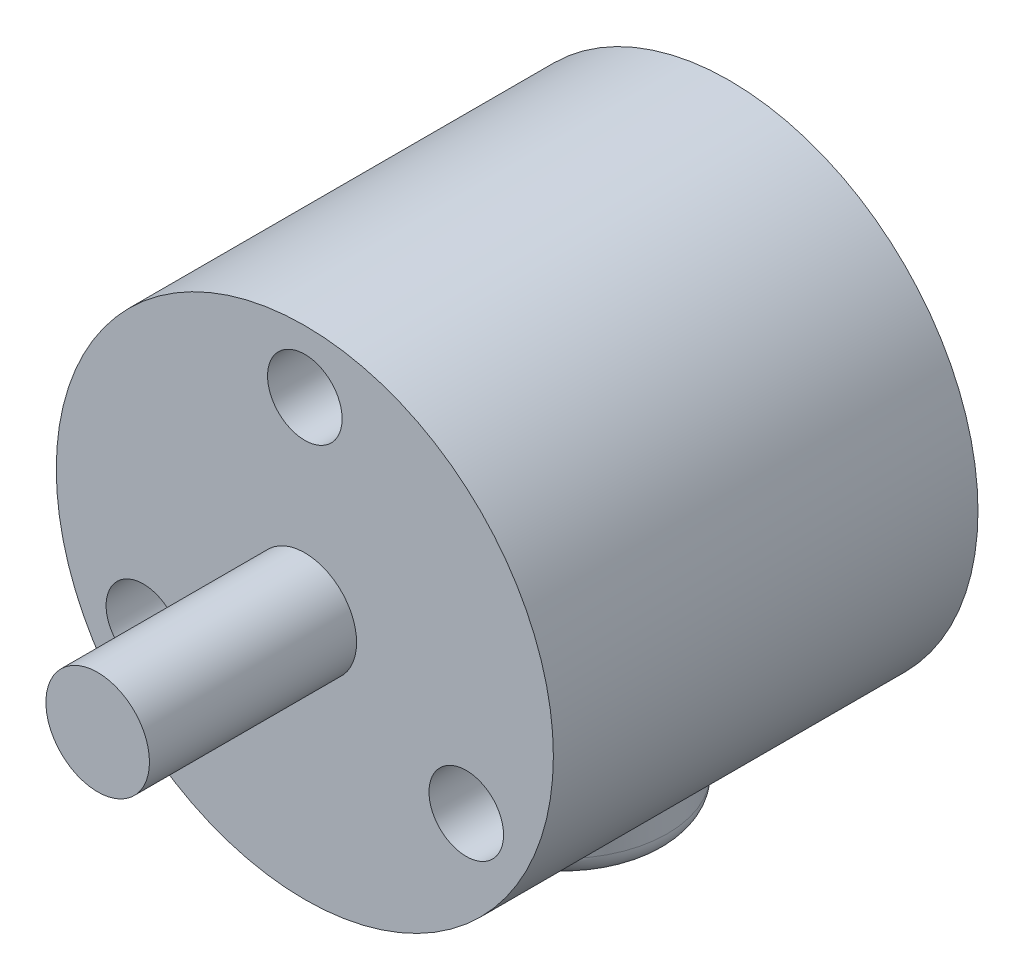
ISO-10303-21;
HEADER;
FILE_DESCRIPTION(('STEP AP214'),'2;1');
FILE_NAME('part.step','',(''),(''),'','','');
FILE_SCHEMA(('AUTOMOTIVE_DESIGN { 1 0 10303 214 1 1 1 1 }'));
ENDSEC;
DATA;
#1=APPLICATION_CONTEXT('core data for automotive mechanical design processes');
#2=APPLICATION_PROTOCOL_DEFINITION('international standard','automotive_design',2000,#1);
#3=PRODUCT_CONTEXT('',#1,'mechanical');
#4=PRODUCT('Part','Part','',(#3));
#5=PRODUCT_RELATED_PRODUCT_CATEGORY('part','',(#4));
#6=PRODUCT_DEFINITION_FORMATION('','',#4);
#7=PRODUCT_DEFINITION_CONTEXT('part definition',#1,'design');
#8=PRODUCT_DEFINITION('design','',#6,#7);
#9=PRODUCT_DEFINITION_SHAPE('','',#8);
#10=(LENGTH_UNIT() NAMED_UNIT(*) SI_UNIT(.MILLI.,.METRE.));
#11=(NAMED_UNIT(*) PLANE_ANGLE_UNIT() SI_UNIT($,.RADIAN.));
#12=(NAMED_UNIT(*) SI_UNIT($,.STERADIAN.) SOLID_ANGLE_UNIT());
#13=UNCERTAINTY_MEASURE_WITH_UNIT(LENGTH_MEASURE(1.E-05),#10,'distance_accuracy_value','');
#14=(GEOMETRIC_REPRESENTATION_CONTEXT(3) GLOBAL_UNCERTAINTY_ASSIGNED_CONTEXT((#13)) GLOBAL_UNIT_ASSIGNED_CONTEXT((#10,
#11,#12)) REPRESENTATION_CONTEXT('',''));
#15=CARTESIAN_POINT('',(0.,0.,0.));
#16=DIRECTION('',(0.,0.,1.));
#17=DIRECTION('',(1.,0.,0.));
#18=AXIS2_PLACEMENT_3D('',#15,#16,#17);
#19=CARTESIAN_POINT('',(0.,0.,20.5));
#20=DIRECTION('',(0.,0.,-1.));
#21=DIRECTION('',(-1.,0.,0.));
#22=AXIS2_PLACEMENT_3D('',#19,#20,#21);
#23=CYLINDRICAL_SURFACE('',#22,12.);
#24=CARTESIAN_POINT('',(0.,-12.,13.));
#25=CARTESIAN_POINT('',(0.133971202199808,-11.9999992729584,12.9999990914666));
#26=CARTESIAN_POINT('',(0.267987722487516,-11.9977503193947,12.9946081945841));
#27=CARTESIAN_POINT('',(0.535066499257948,-11.9888105832946,12.9730948474972));
#28=CARTESIAN_POINT('',(0.668128097998224,-11.9821169900031,12.956965606432));
#29=CARTESIAN_POINT('',(0.932528423558352,-11.9644464126044,12.9140981034186));
#30=CARTESIAN_POINT('',(1.06386304519886,-11.9534606492307,12.8873380952507));
#31=CARTESIAN_POINT('',(1.32363712069101,-11.927490817702,12.8234725282148));
#32=CARTESIAN_POINT('',(1.45207536803167,-11.9125051155232,12.7863627410574));
#33=CARTESIAN_POINT('',(1.70466599018599,-11.8789846295891,12.7023138952485));
#34=CARTESIAN_POINT('',(1.82883288573375,-11.8604636474237,12.6554129961059));
#35=CARTESIAN_POINT('',(2.07264264011727,-11.8202983493247,12.5521104896258));
#36=CARTESIAN_POINT('',(2.19228378684376,-11.7986528660016,12.4957053299424));
#37=CARTESIAN_POINT('',(2.54317702528674,-11.7298276864823,12.3129628809401));
#38=CARTESIAN_POINT('',(2.76673759984579,-11.6787121912958,12.1729849898133));
#39=CARTESIAN_POINT('',(3.19782871405717,-11.5683104696206,11.8534779348464));
#40=CARTESIAN_POINT('',(3.40415336067112,-11.5087569814803,11.672428921225));
#41=CARTESIAN_POINT('',(3.78465099990966,-11.3893017107102,11.2789084865618));
#42=CARTESIAN_POINT('',(3.95880706375339,-11.3293997617084,11.0664206260931));
#43=CARTESIAN_POINT('',(4.19642716763638,-11.2426693606487,10.722276329291));
#44=CARTESIAN_POINT('',(4.27318721758388,-11.213641472833,10.6001426427212));
#45=CARTESIAN_POINT('',(4.41607485285565,-11.158142646463,10.3492739587432));
#46=CARTESIAN_POINT('',(4.48220683770539,-11.1316706517088,10.2205417220864));
#47=CARTESIAN_POINT('',(4.60326824362323,-11.0821570819096,9.95727380138148));
#48=CARTESIAN_POINT('',(4.65819717388443,-11.0591156571702,9.82273786338529));
#49=CARTESIAN_POINT('',(4.75627631879271,-11.0172900479988,9.54886247889822));
#50=CARTESIAN_POINT('',(4.79943258893619,-10.9985036757451,9.40952554359407));
#51=CARTESIAN_POINT('',(4.87173603809854,-10.9666619504758,9.13380805072207));
#52=CARTESIAN_POINT('',(4.90145340480219,-10.9533759137281,8.99760365958737));
#53=CARTESIAN_POINT('',(4.94943501929704,-10.9317788095431,8.72286059838521));
#54=CARTESIAN_POINT('',(4.96770456006234,-10.9234654430414,8.58432303754408));
#55=CARTESIAN_POINT('',(4.9925806714702,-10.9121183161802,8.30602414623231));
#56=CARTESIAN_POINT('',(4.99919025060126,-10.9090831939376,8.16626314078902));
#57=CARTESIAN_POINT('',(5.00066965421038,-10.9084052474415,7.88666968828848));
#58=CARTESIAN_POINT('',(4.99554009665008,-10.9107621393462,7.74683724537919));
#59=CARTESIAN_POINT('',(4.97445537231527,-10.9203897344954,7.47901464805327));
#60=CARTESIAN_POINT('',(4.95936366570947,-10.9272683387031,7.35094126629261));
#61=CARTESIAN_POINT('',(4.91939456846064,-10.9453203456551,7.09659754142487));
#62=CARTESIAN_POINT('',(4.89451397815816,-10.9564951526574,6.97032780186761));
#63=CARTESIAN_POINT('',(4.83521901523602,-10.982791432776,6.72049574743192));
#64=CARTESIAN_POINT('',(4.80080681510625,-10.9979120065088,6.59693282252032));
#65=CARTESIAN_POINT('',(4.72276746407086,-11.0316484281794,6.353225711498));
#66=CARTESIAN_POINT('',(4.67913676011188,-11.0502656234987,6.23308286389346));
#67=CARTESIAN_POINT('',(4.53292198464472,-11.1114348958982,5.87391306752255));
#68=CARTESIAN_POINT('',(4.41623317355433,-11.1587355468125,5.64125821268693));
#69=CARTESIAN_POINT('',(4.14923538558579,-11.2607369782698,5.19804915238382));
#70=CARTESIAN_POINT('',(3.99891315023541,-11.315440673762,4.98750371078817));
#71=CARTESIAN_POINT('',(3.65399862437446,-11.4317164413063,4.57561717753678));
#72=CARTESIAN_POINT('',(3.4567386368719,-11.4934782659376,4.37655771261506));
#73=CARTESIAN_POINT('',(3.0308736497062,-11.6130335162842,4.01352200039607));
#74=CARTESIAN_POINT('',(2.80226132798022,-11.6708260102514,3.84955397136795));
#75=CARTESIAN_POINT('',(2.43728165238545,-11.750564458423,3.63188502116149));
#76=CARTESIAN_POINT('',(2.31032222862648,-11.7762436004382,3.56341446300228));
#77=CARTESIAN_POINT('',(2.05046026272765,-11.8242558878425,3.43749802283573));
#78=CARTESIAN_POINT('',(1.91756015985751,-11.8465903904629,3.38004766623415));
#79=CARTESIAN_POINT('',(1.64677309924856,-11.8872573475038,3.27674472498626));
#80=CARTESIAN_POINT('',(1.50888729966569,-11.9055907244947,3.23088946638133));
#81=CARTESIAN_POINT('',(1.22915368100483,-11.9377129809443,3.15125570058601));
#82=CARTESIAN_POINT('',(1.08730616375715,-11.951502205588,3.11747627606863));
#83=CARTESIAN_POINT('',(0.809887683545695,-11.9733956498248,3.06413586262167));
#84=CARTESIAN_POINT('',(0.674487262769715,-11.981804303078,3.04381063945912));
#85=CARTESIAN_POINT('',(0.402272400346696,-11.9940291261992,3.01432893966274));
#86=CARTESIAN_POINT('',(0.26545803644642,-11.9978455472339,3.00517185220077));
#87=CARTESIAN_POINT('',(-0.00847703491070739,-12.0007785959499,2.99813065484733));
#88=CARTESIAN_POINT('',(-0.145597660207647,-11.9998963609136,3.00024381705729));
#89=CARTESIAN_POINT('',(-0.419090564387011,-11.993459536273,3.01571255277727));
#90=CARTESIAN_POINT('',(-0.555462859843409,-11.9879050505733,3.02906787627665));
#91=CARTESIAN_POINT('',(-0.819630607320878,-11.9726701367381,3.06592509226874));
#92=CARTESIAN_POINT('',(-0.94751451423134,-11.9632093877852,3.08888750454916));
#93=CARTESIAN_POINT('',(-1.20082196325612,-11.940444106674,3.14460593564766));
#94=CARTESIAN_POINT('',(-1.3262446899797,-11.9271383228689,3.17736514366791));
#95=CARTESIAN_POINT('',(-1.57375204172412,-11.8970094891313,3.25236741168871));
#96=CARTESIAN_POINT('',(-1.69583759693526,-11.8801874308528,3.29460779807032));
#97=CARTESIAN_POINT('',(-1.93599084783536,-11.8434257462031,3.38821332811291));
#98=CARTESIAN_POINT('',(-2.05405699265853,-11.8234849327137,3.43958194734866));
#99=CARTESIAN_POINT('',(-2.40829498205295,-11.758346790855,3.61023048200071));
#100=CARTESIAN_POINT('',(-2.63698994915988,-11.7087843162294,3.74377555233129));
#101=CARTESIAN_POINT('',(-3.06942387949653,-11.6029475237576,4.04423069860453));
#102=CARTESIAN_POINT('',(-3.27315236592591,-11.5466704076328,4.21115470470482));
#103=CARTESIAN_POINT('',(-3.66531769677002,-11.4284863692559,4.58759654117524));
#104=CARTESIAN_POINT('',(-3.85162119447865,-11.3664645360616,4.79930583321336));
#105=CARTESIAN_POINT('',(-4.18670098676195,-11.2473669968316,5.25213329340222));
#106=CARTESIAN_POINT('',(-4.33546875898715,-11.1902924159789,5.49325812184049));
#107=CARTESIAN_POINT('',(-4.52791722204378,-11.1131825672233,5.8742799790697));
#108=CARTESIAN_POINT('',(-4.58727880369506,-11.0887445801545,6.00557844323251));
#109=CARTESIAN_POINT('',(-4.69462511155256,-11.0437261293759,6.27336529062487));
#110=CARTESIAN_POINT('',(-4.74261484462541,-11.0231439688385,6.40985135899436));
#111=CARTESIAN_POINT('',(-4.82668853878451,-10.9865909853452,6.68697231949228));
#112=CARTESIAN_POINT('',(-4.86277797828965,-10.9706180409148,6.82760526998631));
#113=CARTESIAN_POINT('',(-4.92264916938559,-10.9438843614028,7.11195411229506));
#114=CARTESIAN_POINT('',(-4.94643207850299,-10.9331231361237,7.25566971283738));
#115=CARTESIAN_POINT('',(-4.9800298567505,-10.9178575324529,7.53376050190687));
#116=CARTESIAN_POINT('',(-4.99078127149666,-10.9129342806299,7.66800030408615));
#117=CARTESIAN_POINT('',(-5.00141640257177,-10.9080644511076,7.93704951835245));
#118=CARTESIAN_POINT('',(-5.00129648146308,-10.9081195391098,8.07185910599751));
#119=CARTESIAN_POINT('',(-4.99018296923951,-10.9132080645731,8.34086161118506));
#120=CARTESIAN_POINT('',(-4.97919509044956,-10.9182388867303,8.47505481548039));
#121=CARTESIAN_POINT('',(-4.94647921783658,-10.933099505538,8.74190431694874));
#122=CARTESIAN_POINT('',(-4.92474717591724,-10.9429311109705,8.87456001553816));
#123=CARTESIAN_POINT('',(-4.87205259520336,-10.966489611938,9.13112051872267));
#124=CARTESIAN_POINT('',(-4.84157230887098,-10.9800115342469,9.25514344248263));
#125=CARTESIAN_POINT('',(-4.77136925956337,-11.0106991045504,9.50009782053465));
#126=CARTESIAN_POINT('',(-4.73164330745016,-11.0278660096413,9.62102819209136));
#127=CARTESIAN_POINT('',(-4.59908761582496,-11.0841175717513,9.97806154942845));
#128=CARTESIAN_POINT('',(-4.49284253561317,-11.1279707524951,10.2085872556077));
#129=CARTESIAN_POINT('',(-4.24040889849447,-11.226679213664,10.6628156060107));
#130=CARTESIAN_POINT('',(-4.09220273518373,-11.2820374827937,10.8852745547109));
#131=CARTESIAN_POINT('',(-3.76270798192949,-11.396154190208,11.3034553285329));
#132=CARTESIAN_POINT('',(-3.58140792090314,-11.4549138026364,11.499167841482));
#133=CARTESIAN_POINT('',(-3.28060198965565,-11.5433831914863,11.7759891123433));
#134=CARTESIAN_POINT('',(-3.17135125699736,-11.5739466268846,11.8682042514757));
#135=CARTESIAN_POINT('',(-2.94510913832992,-11.6335718153871,12.0431112048865));
#136=CARTESIAN_POINT('',(-2.82812052219569,-11.6626340992841,12.1258063982126));
#137=CARTESIAN_POINT('',(-2.58697642479179,-11.7184848881627,12.281138652427));
#138=CARTESIAN_POINT('',(-2.46281438535245,-11.7452712553474,12.3537662962983));
#139=CARTESIAN_POINT('',(-2.2082535237545,-11.7957806454889,12.4882427852065));
#140=CARTESIAN_POINT('',(-2.07785761247781,-11.8195050794223,12.5500965995833));
#141=CARTESIAN_POINT('',(-1.81380017769054,-11.8628724264483,12.6615810427001));
#142=CARTESIAN_POINT('',(-1.68022444756869,-11.8825746428453,12.7113916311525));
#143=CARTESIAN_POINT('',(-1.40886045780292,-11.9177941454219,12.7995260141615));
#144=CARTESIAN_POINT('',(-1.27107423050946,-11.9333134162086,12.8378552570307));
#145=CARTESIAN_POINT('',(-0.992651980203959,-11.959688566513,12.9025525244881));
#146=CARTESIAN_POINT('',(-0.852023905428952,-11.9705559590045,12.9289500880649));
#147=CARTESIAN_POINT('',(-0.56880246605397,-11.9873498855457,12.9695979090313));
#148=CARTESIAN_POINT('',(-0.426210622389143,-11.9932800463356,12.9838570830855));
#149=CARTESIAN_POINT('',(-0.236110915428313,-11.9977699594236,12.9946457709799));
#150=CARTESIAN_POINT('',(-0.188916808355246,-11.9986057728967,12.9966530624495));
#151=CARTESIAN_POINT('',(-0.0944836795338208,-11.9997209221766,12.9993303390705));
#152=CARTESIAN_POINT('',(-0.0472446576572318,-12.0000002563897,13.0000003203924));
#153=CARTESIAN_POINT('',(0.,-12.,13.));
#154=B_SPLINE_CURVE_WITH_KNOTS('',3,(#24,#25,#26,#27,#28,#29,#30,#31,#32,#33,#34,#35,#36,#37,
#38,#39,#40,#41,#42,#43,#44,#45,#46,#47,#48,#49,#50,#51,#52,#53,#54,#55,#56,#57,#58,#59,#60,#61,
#62,#63,#64,#65,#66,#67,#68,#69,#70,#71,#72,#73,#74,#75,#76,#77,#78,#79,#80,#81,#82,#83,#84,#85,
#86,#87,#88,#89,#90,#91,#92,#93,#94,#95,#96,#97,#98,#99,#100,#101,#102,#103,#104,#105,#106,#107,
#108,#109,#110,#111,#112,#113,#114,#115,#116,#117,#118,#119,#120,#121,#122,#123,#124,#125,#126,
#127,#128,#129,#130,#131,#132,#133,#134,#135,#136,#137,#138,#139,#140,#141,#142,#143,#144,#145,
#146,#147,#148,#149,#150,#151,#152,#153),.UNSPECIFIED.,.T.,.F.,(4,2,2,2,2,2,2,2,2,2,2,2,2,2,2,2,
2,2,2,2,2,2,2,2,2,2,2,2,2,2,2,2,2,2,2,2,2,2,2,2,2,2,2,2,2,2,2,2,2,2,2,2,2,2,2,2,2,2,2,2,2,2,2,2,
4),(0.,0.401865511192765,0.803985401292742,1.20693213583696,1.61004373163513,2.01161264408377,
2.41333198262602,3.21570232241271,4.05488202655309,4.89450210025943,5.33547541815659,
5.77626572075065,6.21707533026384,6.657657771416,7.07721787938552,7.49658385769289,
7.91584161588806,8.33507730438084,8.72205078978925,9.10915086914489,9.49616279130698,
9.88332415102038,10.6733254842805,11.4636387906201,12.3207426070477,13.1780469345154,
13.6171124056289,14.0559992214016,14.4947847324951,14.9335369046603,15.3445355807386,
15.755511776716,16.1663885028034,16.5772560917832,16.9676245545711,17.3581202346347,
17.7485059359724,18.1390405964013,18.9435709432164,19.7484377511098,20.6108250535017,
21.4734079819436,21.911378276108,22.3491553782635,22.7867306630771,23.2242647829867,
23.6280231699892,24.0319166509118,24.435597953478,24.8394314677677,25.2242700123875,
25.6092414978881,26.3786352973221,27.1942912351952,28.0102304363353,28.4483841335548,
28.8863818280895,29.3247864929416,29.7629884086909,30.1941695396216,30.6251457342279,
31.0550490470869,31.4846362867339,31.6263528931453,31.7680699053748),.UNSPECIFIED.);
#155=CARTESIAN_POINT('',(0.,-12.,13.));
#156=VERTEX_POINT('',#155);
#157=EDGE_CURVE('E55',#156,#156,#154,.T.);
#158=ORIENTED_EDGE('',*,*,#157,.T.);
#159=EDGE_LOOP('',(#158));
#160=FACE_BOUND('',#159,.T.);
#161=CARTESIAN_POINT('',(0.,0.,20.5));
#162=DIRECTION('',(0.,0.,1.));
#163=DIRECTION('',(1.,0.,0.));
#164=AXIS2_PLACEMENT_3D('',#161,#162,#163);
#165=CIRCLE('',#164,12.);
#166=CARTESIAN_POINT('',(12.,0.,20.5));
#167=VERTEX_POINT('',#166);
#168=EDGE_CURVE('E52',#167,#167,#165,.T.);
#169=ORIENTED_EDGE('',*,*,#168,.F.);
#170=EDGE_LOOP('',(#169));
#171=FACE_BOUND('',#170,.T.);
#172=CARTESIAN_POINT('',(0.,0.,0.));
#173=DIRECTION('',(0.,0.,1.));
#174=DIRECTION('',(1.,0.,0.));
#175=AXIS2_PLACEMENT_3D('',#172,#173,#174);
#176=CIRCLE('',#175,12.);
#177=CARTESIAN_POINT('',(12.,0.,0.));
#178=VERTEX_POINT('',#177);
#179=EDGE_CURVE('E63',#178,#178,#176,.T.);
#180=ORIENTED_EDGE('',*,*,#179,.T.);
#181=EDGE_LOOP('',(#180));
#182=FACE_BOUND('',#181,.T.);
#183=ADVANCED_FACE('F37',(#160,#171,#182),#23,.T.);
#184=CARTESIAN_POINT('',(0.,0.,20.5));
#185=DIRECTION('',(0.,0.,1.));
#186=DIRECTION('',(1.,0.,0.));
#187=AXIS2_PLACEMENT_3D('',#184,#185,#186);
#188=PLANE('',#187);
#189=CARTESIAN_POINT('',(-7.79422863405991,-4.50000000000006,20.5));
#190=DIRECTION('',(0.,0.,1.));
#191=DIRECTION('',(1.,0.,0.));
#192=AXIS2_PLACEMENT_3D('',#189,#190,#191);
#193=CIRCLE('',#192,1.8);
#194=CARTESIAN_POINT('',(-5.99422863405991,-4.50000000000006,20.5));
#195=VERTEX_POINT('',#194);
#196=EDGE_CURVE('E128',#195,#195,#193,.T.);
#197=ORIENTED_EDGE('',*,*,#196,.F.);
#198=EDGE_LOOP('',(#197));
#199=FACE_BOUND('',#198,.T.);
#200=CARTESIAN_POINT('',(7.79422863405994,-4.50000000000001,20.5));
#201=DIRECTION('',(0.,0.,1.));
#202=DIRECTION('',(1.,0.,0.));
#203=AXIS2_PLACEMENT_3D('',#200,#201,#202);
#204=CIRCLE('',#203,1.8);
#205=CARTESIAN_POINT('',(9.59422863405994,-4.50000000000001,20.5));
#206=VERTEX_POINT('',#205);
#207=EDGE_CURVE('E138',#206,#206,#204,.T.);
#208=ORIENTED_EDGE('',*,*,#207,.F.);
#209=EDGE_LOOP('',(#208));
#210=FACE_BOUND('',#209,.T.);
#211=CARTESIAN_POINT('',(0.,9.,20.5));
#212=DIRECTION('',(0.,0.,1.));
#213=DIRECTION('',(1.,0.,0.));
#214=AXIS2_PLACEMENT_3D('',#211,#212,#213);
#215=CIRCLE('',#214,1.8);
#216=CARTESIAN_POINT('',(1.8,9.,20.5));
#217=VERTEX_POINT('',#216);
#218=EDGE_CURVE('E144',#217,#217,#215,.T.);
#219=ORIENTED_EDGE('',*,*,#218,.F.);
#220=EDGE_LOOP('',(#219));
#221=FACE_BOUND('',#220,.T.);
#222=CARTESIAN_POINT('',(0.,0.,20.5));
#223=DIRECTION('',(0.,0.,1.));
#224=DIRECTION('',(1.,0.,0.));
#225=AXIS2_PLACEMENT_3D('',#222,#223,#224);
#226=CIRCLE('',#225,2.5);
#227=CARTESIAN_POINT('',(2.5,0.,20.5));
#228=VERTEX_POINT('',#227);
#229=EDGE_CURVE('E48',#228,#228,#226,.T.);
#230=ORIENTED_EDGE('',*,*,#229,.F.);
#231=EDGE_LOOP('',(#230));
#232=FACE_BOUND('',#231,.T.);
#233=ORIENTED_EDGE('',*,*,#168,.T.);
#234=EDGE_LOOP('',(#233));
#235=FACE_BOUND('',#234,.T.);
#236=ADVANCED_FACE('F106',(#199,#210,#221,#232,#235),#188,.T.);
#237=CARTESIAN_POINT('',(0.,0.,0.));
#238=DIRECTION('',(0.,0.,1.));
#239=DIRECTION('',(1.,0.,0.));
#240=AXIS2_PLACEMENT_3D('',#237,#238,#239);
#241=PLANE('',#240);
#242=ORIENTED_EDGE('',*,*,#179,.F.);
#243=EDGE_LOOP('',(#242));
#244=FACE_BOUND('',#243,.T.);
#245=ADVANCED_FACE('F104',(#244),#241,.F.);
#246=CARTESIAN_POINT('',(0.,0.,24.));
#247=DIRECTION('',(0.,0.,-1.));
#248=DIRECTION('',(-1.,0.,0.));
#249=AXIS2_PLACEMENT_3D('',#246,#247,#248);
#250=CYLINDRICAL_SURFACE('',#249,2.5);
#251=ORIENTED_EDGE('',*,*,#229,.T.);
#252=EDGE_LOOP('',(#251));
#253=FACE_BOUND('',#252,.T.);
#254=CARTESIAN_POINT('',(0.,0.,30.5));
#255=DIRECTION('',(0.,0.,1.));
#256=DIRECTION('',(1.,0.,0.));
#257=AXIS2_PLACEMENT_3D('',#254,#255,#256);
#258=CIRCLE('',#257,2.5);
#259=CARTESIAN_POINT('',(2.5,0.,30.5));
#260=VERTEX_POINT('',#259);
#261=EDGE_CURVE('E62',#260,#260,#258,.T.);
#262=ORIENTED_EDGE('',*,*,#261,.F.);
#263=EDGE_LOOP('',(#262));
#264=FACE_BOUND('',#263,.T.);
#265=ADVANCED_FACE('F100',(#253,#264),#250,.T.);
#266=CARTESIAN_POINT('',(0.,9.,17.5));
#267=DIRECTION('',(0.,0.,1.));
#268=DIRECTION('',(1.,0.,0.));
#269=AXIS2_PLACEMENT_3D('',#266,#267,#268);
#270=CYLINDRICAL_SURFACE('',#269,1.8);
#271=CARTESIAN_POINT('',(0.,9.,17.5));
#272=DIRECTION('',(0.,0.,1.));
#273=DIRECTION('',(1.,0.,0.));
#274=AXIS2_PLACEMENT_3D('',#271,#272,#273);
#275=CIRCLE('',#274,1.8);
#276=CARTESIAN_POINT('',(1.8,9.,17.5));
#277=VERTEX_POINT('',#276);
#278=EDGE_CURVE('E141',#277,#277,#275,.T.);
#279=ORIENTED_EDGE('',*,*,#278,.F.);
#280=EDGE_LOOP('',(#279));
#281=FACE_BOUND('',#280,.T.);
#282=ORIENTED_EDGE('',*,*,#218,.T.);
#283=EDGE_LOOP('',(#282));
#284=FACE_BOUND('',#283,.T.);
#285=ADVANCED_FACE('F96',(#281,#284),#270,.F.);
#286=CARTESIAN_POINT('',(0.,0.,17.5));
#287=DIRECTION('',(0.,0.,1.));
#288=DIRECTION('',(1.,0.,0.));
#289=AXIS2_PLACEMENT_3D('',#286,#287,#288);
#290=PLANE('',#289);
#291=ORIENTED_EDGE('',*,*,#278,.T.);
#292=EDGE_LOOP('',(#291));
#293=FACE_BOUND('',#292,.T.);
#294=ADVANCED_FACE('F92',(#293),#290,.T.);
#295=CARTESIAN_POINT('',(7.79422863405994,-4.50000000000001,17.5));
#296=DIRECTION('',(0.,0.,1.));
#297=DIRECTION('',(1.,0.,0.));
#298=AXIS2_PLACEMENT_3D('',#295,#296,#297);
#299=CYLINDRICAL_SURFACE('',#298,1.8);
#300=CARTESIAN_POINT('',(7.79422863405994,-4.50000000000001,17.5));
#301=DIRECTION('',(0.,0.,1.));
#302=DIRECTION('',(1.,0.,0.));
#303=AXIS2_PLACEMENT_3D('',#300,#301,#302);
#304=CIRCLE('',#303,1.8);
#305=CARTESIAN_POINT('',(9.59422863405994,-4.50000000000001,17.5));
#306=VERTEX_POINT('',#305);
#307=EDGE_CURVE('E132',#306,#306,#304,.T.);
#308=ORIENTED_EDGE('',*,*,#307,.F.);
#309=EDGE_LOOP('',(#308));
#310=FACE_BOUND('',#309,.T.);
#311=ORIENTED_EDGE('',*,*,#207,.T.);
#312=EDGE_LOOP('',(#311));
#313=FACE_BOUND('',#312,.T.);
#314=ADVANCED_FACE('F88',(#310,#313),#299,.F.);
#315=CARTESIAN_POINT('',(0.,0.,17.5));
#316=DIRECTION('',(0.,0.,1.));
#317=DIRECTION('',(1.,0.,0.));
#318=AXIS2_PLACEMENT_3D('',#315,#316,#317);
#319=PLANE('',#318);
#320=ORIENTED_EDGE('',*,*,#307,.T.);
#321=EDGE_LOOP('',(#320));
#322=FACE_BOUND('',#321,.T.);
#323=ADVANCED_FACE('F84',(#322),#319,.T.);
#324=CARTESIAN_POINT('',(-7.79422863405991,-4.50000000000006,17.5));
#325=DIRECTION('',(0.,0.,1.));
#326=DIRECTION('',(1.,0.,0.));
#327=AXIS2_PLACEMENT_3D('',#324,#325,#326);
#328=CYLINDRICAL_SURFACE('',#327,1.8);
#329=CARTESIAN_POINT('',(-7.79422863405991,-4.50000000000006,17.5));
#330=DIRECTION('',(0.,0.,1.));
#331=DIRECTION('',(1.,0.,0.));
#332=AXIS2_PLACEMENT_3D('',#329,#330,#331);
#333=CIRCLE('',#332,1.8);
#334=CARTESIAN_POINT('',(-5.99422863405991,-4.50000000000006,17.5));
#335=VERTEX_POINT('',#334);
#336=EDGE_CURVE('E126',#335,#335,#333,.T.);
#337=ORIENTED_EDGE('',*,*,#336,.F.);
#338=EDGE_LOOP('',(#337));
#339=FACE_BOUND('',#338,.T.);
#340=ORIENTED_EDGE('',*,*,#196,.T.);
#341=EDGE_LOOP('',(#340));
#342=FACE_BOUND('',#341,.T.);
#343=ADVANCED_FACE('F80',(#339,#342),#328,.F.);
#344=CARTESIAN_POINT('',(0.,0.,17.5));
#345=DIRECTION('',(0.,0.,1.));
#346=DIRECTION('',(1.,0.,0.));
#347=AXIS2_PLACEMENT_3D('',#344,#345,#346);
#348=PLANE('',#347);
#349=ORIENTED_EDGE('',*,*,#336,.T.);
#350=EDGE_LOOP('',(#349));
#351=FACE_BOUND('',#350,.T.);
#352=ADVANCED_FACE('F76',(#351),#348,.T.);
#353=CARTESIAN_POINT('',(0.,0.,30.5));
#354=DIRECTION('',(0.,0.,1.));
#355=DIRECTION('',(1.,0.,0.));
#356=AXIS2_PLACEMENT_3D('',#353,#354,#355);
#357=PLANE('',#356);
#358=ORIENTED_EDGE('',*,*,#261,.T.);
#359=EDGE_LOOP('',(#358));
#360=FACE_BOUND('',#359,.T.);
#361=ADVANCED_FACE('F73',(#360),#357,.T.);
#362=CARTESIAN_POINT('',(0.,-14.,8.));
#363=DIRECTION('',(0.,1.,0.));
#364=DIRECTION('',(0.,0.,1.));
#365=AXIS2_PLACEMENT_3D('',#362,#363,#364);
#366=CYLINDRICAL_SURFACE('',#365,5.);
#367=CARTESIAN_POINT('',(0.,-13.,8.));
#368=DIRECTION('',(0.,1.,0.));
#369=DIRECTION('',(0.,0.,1.));
#370=AXIS2_PLACEMENT_3D('',#367,#368,#369);
#371=CIRCLE('',#370,5.);
#372=CARTESIAN_POINT('',(0.,-13.,13.));
#373=VERTEX_POINT('',#372);
#374=EDGE_CURVE('E44',#373,#373,#371,.T.);
#375=ORIENTED_EDGE('',*,*,#374,.T.);
#376=EDGE_LOOP('',(#375));
#377=FACE_BOUND('',#376,.T.);
#378=ORIENTED_EDGE('',*,*,#157,.F.);
#379=EDGE_LOOP('',(#378));
#380=FACE_BOUND('',#379,.T.);
#381=ADVANCED_FACE('F67',(#377,#380),#366,.T.);
#382=CARTESIAN_POINT('',(0.,-14.,8.));
#383=DIRECTION('',(0.,1.,0.));
#384=DIRECTION('',(0.,0.,1.));
#385=AXIS2_PLACEMENT_3D('',#382,#383,#384);
#386=PLANE('',#385);
#387=CARTESIAN_POINT('',(0.,-14.,8.));
#388=DIRECTION('',(0.,1.,0.));
#389=DIRECTION('',(0.,0.,1.));
#390=AXIS2_PLACEMENT_3D('',#387,#388,#389);
#391=CIRCLE('',#390,4.);
#392=CARTESIAN_POINT('',(0.,-14.,12.));
#393=VERTEX_POINT('',#392);
#394=EDGE_CURVE('E10',#393,#393,#391,.F.);
#395=ORIENTED_EDGE('',*,*,#394,.T.);
#396=EDGE_LOOP('',(#395));
#397=FACE_BOUND('',#396,.T.);
#398=ADVANCED_FACE('F72',(#397),#386,.F.);
#399=CARTESIAN_POINT('',(0.,-13.,8.));
#400=DIRECTION('',(0.,1.,0.));
#401=DIRECTION('',(0.,0.,1.));
#402=AXIS2_PLACEMENT_3D('',#399,#400,#401);
#403=TOROIDAL_SURFACE('',#402,4.,1.);
#404=ORIENTED_EDGE('',*,*,#394,.F.);
#405=EDGE_LOOP('',(#404));
#406=FACE_BOUND('',#405,.T.);
#407=ORIENTED_EDGE('',*,*,#374,.F.);
#408=EDGE_LOOP('',(#407));
#409=FACE_BOUND('',#408,.T.);
#410=ADVANCED_FACE('F39',(#406,#409),#403,.T.);
#411=CLOSED_SHELL('',(#183,#236,#245,#265,#285,#294,#314,#323,#343,#352,#361,#381,#398,#410));
#412=MANIFOLD_SOLID_BREP('B2',#411);
#413=ADVANCED_BREP_SHAPE_REPRESENTATION('',(#18,#412),#14);
#414=SHAPE_DEFINITION_REPRESENTATION(#9,#413);
ENDSEC;
END-ISO-10303-21;
